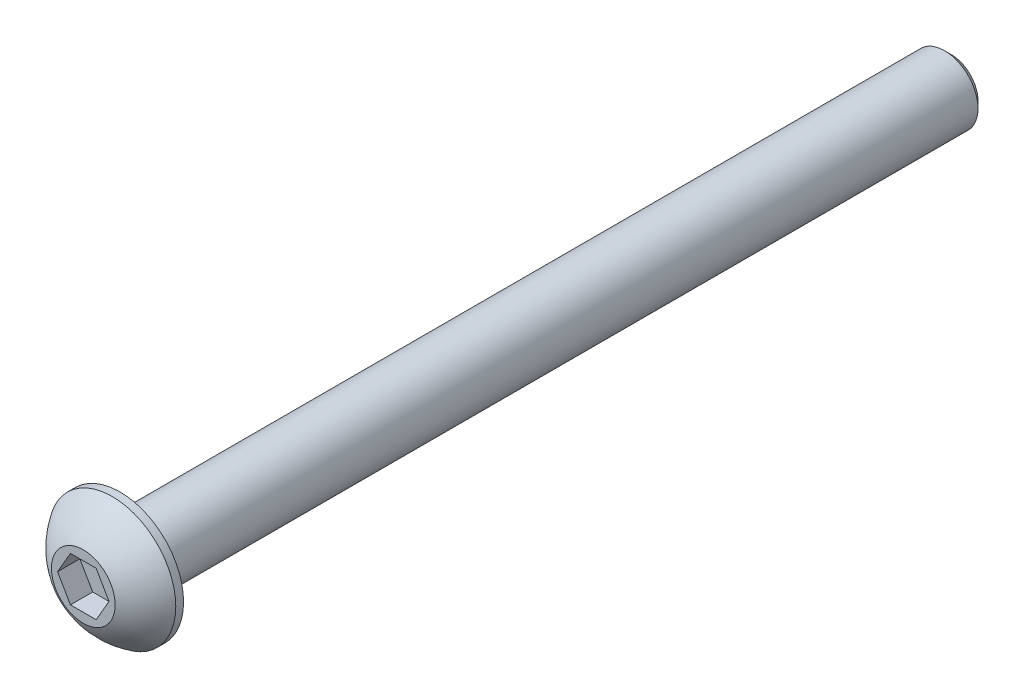
ISO-10303-21;
HEADER;
FILE_DESCRIPTION(('STEP AP214'),'2;1');
FILE_NAME('part.step','',(''),(''),'','','');
FILE_SCHEMA(('AUTOMOTIVE_DESIGN { 1 0 10303 214 1 1 1 1 }'));
ENDSEC;
DATA;
#1=APPLICATION_CONTEXT('core data for automotive mechanical design processes');
#2=APPLICATION_PROTOCOL_DEFINITION('international standard','automotive_design',2000,#1);
#3=PRODUCT_CONTEXT('',#1,'mechanical');
#4=PRODUCT('Part','Part','',(#3));
#5=PRODUCT_RELATED_PRODUCT_CATEGORY('part','',(#4));
#6=PRODUCT_DEFINITION_FORMATION('','',#4);
#7=PRODUCT_DEFINITION_CONTEXT('part definition',#1,'design');
#8=PRODUCT_DEFINITION('design','',#6,#7);
#9=PRODUCT_DEFINITION_SHAPE('','',#8);
#10=(LENGTH_UNIT() NAMED_UNIT(*) SI_UNIT(.MILLI.,.METRE.));
#11=(NAMED_UNIT(*) PLANE_ANGLE_UNIT() SI_UNIT($,.RADIAN.));
#12=(NAMED_UNIT(*) SI_UNIT($,.STERADIAN.) SOLID_ANGLE_UNIT());
#13=UNCERTAINTY_MEASURE_WITH_UNIT(LENGTH_MEASURE(1.E-05),#10,'distance_accuracy_value','');
#14=(GEOMETRIC_REPRESENTATION_CONTEXT(3) GLOBAL_UNCERTAINTY_ASSIGNED_CONTEXT((#13)) GLOBAL_UNIT_ASSIGNED_CONTEXT((#10,
#11,#12)) REPRESENTATION_CONTEXT('',''));
#15=CARTESIAN_POINT('',(0.,0.,0.));
#16=DIRECTION('',(0.,0.,1.));
#17=DIRECTION('',(1.,0.,0.));
#18=AXIS2_PLACEMENT_3D('',#15,#16,#17);
#19=CARTESIAN_POINT('',(0.,0.,-37.3));
#20=DIRECTION('',(0.,0.,1.));
#21=DIRECTION('',(1.,0.,0.));
#22=AXIS2_PLACEMENT_3D('',#19,#20,#21);
#23=PLANE('',#22);
#24=CARTESIAN_POINT('',(0.,0.,-37.3));
#25=DIRECTION('',(0.,0.,1.));
#26=DIRECTION('',(1.,0.,0.));
#27=AXIS2_PLACEMENT_3D('',#24,#25,#26);
#28=CIRCLE('',#27,1.19999999999999);
#29=CARTESIAN_POINT('',(1.19999999999999,0.,-37.3));
#30=VERTEX_POINT('',#29);
#31=EDGE_CURVE('E11',#30,#30,#28,.F.);
#32=ORIENTED_EDGE('',*,*,#31,.T.);
#33=EDGE_LOOP('',(#32));
#34=FACE_BOUND('',#33,.T.);
#35=ADVANCED_FACE('F46',(#34),#23,.F.);
#36=CARTESIAN_POINT('',(0.,0.,1.65));
#37=DIRECTION('',(0.,0.,-1.));
#38=DIRECTION('',(-1.,0.,0.));
#39=AXIS2_PLACEMENT_3D('',#36,#37,#38);
#40=PLANE('',#39);
#41=DIRECTION('',(-0.5,-0.866025403784439,0.));
#42=VECTOR('',#41,1.);
#43=CARTESIAN_POINT('',(-0.577350269189626,1.,1.65));
#44=LINE('',#43,#42);
#45=CARTESIAN_POINT('',(-0.577350269189626,1.,1.65));
#46=VERTEX_POINT('',#45);
#47=CARTESIAN_POINT('',(-1.15470053837925,0.,1.65));
#48=VERTEX_POINT('',#47);
#49=EDGE_CURVE('E136',#46,#48,#44,.T.);
#50=ORIENTED_EDGE('',*,*,#49,.F.);
#51=DIRECTION('',(-1.,0.,0.));
#52=VECTOR('',#51,1.);
#53=CARTESIAN_POINT('',(0.577350269189626,1.,1.65));
#54=LINE('',#53,#52);
#55=CARTESIAN_POINT('',(0.577350269189626,1.,1.65));
#56=VERTEX_POINT('',#55);
#57=EDGE_CURVE('E62',#56,#46,#54,.T.);
#58=ORIENTED_EDGE('',*,*,#57,.F.);
#59=DIRECTION('',(-0.5,0.866025403784438,0.));
#60=VECTOR('',#59,1.);
#61=CARTESIAN_POINT('',(1.15470053837925,0.,1.65));
#62=LINE('',#61,#60);
#63=CARTESIAN_POINT('',(1.15470053837925,0.,1.65));
#64=VERTEX_POINT('',#63);
#65=EDGE_CURVE('E145',#64,#56,#62,.T.);
#66=ORIENTED_EDGE('',*,*,#65,.F.);
#67=DIRECTION('',(0.5,0.866025403784439,0.));
#68=VECTOR('',#67,1.);
#69=CARTESIAN_POINT('',(0.577350269189626,-1.,1.65));
#70=LINE('',#69,#68);
#71=CARTESIAN_POINT('',(0.577350269189626,-1.,1.65));
#72=VERTEX_POINT('',#71);
#73=EDGE_CURVE('E143',#72,#64,#70,.T.);
#74=ORIENTED_EDGE('',*,*,#73,.F.);
#75=DIRECTION('',(1.,0.,0.));
#76=VECTOR('',#75,1.);
#77=CARTESIAN_POINT('',(-0.577350269189625,-1.,1.65));
#78=LINE('',#77,#76);
#79=CARTESIAN_POINT('',(-0.577350269189625,-1.,1.65));
#80=VERTEX_POINT('',#79);
#81=EDGE_CURVE('E110',#80,#72,#78,.T.);
#82=ORIENTED_EDGE('',*,*,#81,.F.);
#83=DIRECTION('',(0.5,-0.866025403784438,0.));
#84=VECTOR('',#83,1.);
#85=CARTESIAN_POINT('',(-1.15470053837925,0.,1.65));
#86=LINE('',#85,#84);
#87=EDGE_CURVE('E139',#48,#80,#86,.T.);
#88=ORIENTED_EDGE('',*,*,#87,.F.);
#89=EDGE_LOOP('',(#50,#58,#66,#74,#82,#88));
#90=FACE_BOUND('',#89,.T.);
#91=CARTESIAN_POINT('',(0.,0.,1.65));
#92=DIRECTION('',(0.,0.,1.));
#93=DIRECTION('',(1.,0.,0.));
#94=AXIS2_PLACEMENT_3D('',#91,#92,#93);
#95=CIRCLE('',#94,1.43);
#96=CARTESIAN_POINT('',(1.43,0.,1.65));
#97=VERTEX_POINT('',#96);
#98=EDGE_CURVE('E163',#97,#97,#95,.T.);
#99=ORIENTED_EDGE('',*,*,#98,.T.);
#100=EDGE_LOOP('',(#99));
#101=FACE_BOUND('',#100,.T.);
#102=ADVANCED_FACE('F180',(#90,#101),#40,.F.);
#103=CARTESIAN_POINT('',(0.,0.,-1.52032985611787));
#104=DIRECTION('',(0.,0.,1.));
#105=DIRECTION('',(1.,0.,0.));
#106=AXIS2_PLACEMENT_3D('',#103,#104,#105);
#107=DEGENERATE_TOROIDAL_SURFACE('',#106,0.167344234474104,3.55,.F.);
#108=ORIENTED_EDGE('',*,*,#98,.F.);
#109=EDGE_LOOP('',(#108));
#110=FACE_BOUND('',#109,.T.);
#111=CARTESIAN_POINT('',(0.,0.,0.35));
#112=DIRECTION('',(0.,0.,1.));
#113=DIRECTION('',(1.,0.,0.));
#114=AXIS2_PLACEMENT_3D('',#111,#112,#113);
#115=CIRCLE('',#114,2.85);
#116=CARTESIAN_POINT('',(2.85,0.,0.35));
#117=VERTEX_POINT('',#116);
#118=EDGE_CURVE('E160',#117,#117,#115,.T.);
#119=ORIENTED_EDGE('',*,*,#118,.T.);
#120=EDGE_LOOP('',(#119));
#121=FACE_BOUND('',#120,.T.);
#122=ADVANCED_FACE('F185',(#110,#121),#107,.F.);
#123=CARTESIAN_POINT('',(0.,0.,0.));
#124=DIRECTION('',(0.,0.,1.));
#125=DIRECTION('',(1.,0.,0.));
#126=AXIS2_PLACEMENT_3D('',#123,#124,#125);
#127=CYLINDRICAL_SURFACE('',#126,2.85);
#128=ORIENTED_EDGE('',*,*,#118,.F.);
#129=EDGE_LOOP('',(#128));
#130=FACE_BOUND('',#129,.T.);
#131=CARTESIAN_POINT('',(0.,0.,0.));
#132=DIRECTION('',(0.,0.,1.));
#133=DIRECTION('',(1.,0.,0.));
#134=AXIS2_PLACEMENT_3D('',#131,#132,#133);
#135=CIRCLE('',#134,2.85);
#136=CARTESIAN_POINT('',(2.85,0.,0.));
#137=VERTEX_POINT('',#136);
#138=EDGE_CURVE('E157',#137,#137,#135,.T.);
#139=ORIENTED_EDGE('',*,*,#138,.T.);
#140=EDGE_LOOP('',(#139));
#141=FACE_BOUND('',#140,.T.);
#142=ADVANCED_FACE('F191',(#130,#141),#127,.T.);
#143=CARTESIAN_POINT('',(0.,1.5,0.));
#144=DIRECTION('',(0.,0.,1.));
#145=DIRECTION('',(1.,0.,0.));
#146=AXIS2_PLACEMENT_3D('',#143,#144,#145);
#147=PLANE('',#146);
#148=ORIENTED_EDGE('',*,*,#138,.F.);
#149=EDGE_LOOP('',(#148));
#150=FACE_BOUND('',#149,.T.);
#151=CARTESIAN_POINT('',(0.,0.,0.));
#152=DIRECTION('',(0.,0.,1.));
#153=DIRECTION('',(1.,0.,0.));
#154=AXIS2_PLACEMENT_3D('',#151,#152,#153);
#155=CIRCLE('',#154,1.5);
#156=CARTESIAN_POINT('',(1.5,0.,0.));
#157=VERTEX_POINT('',#156);
#158=EDGE_CURVE('E149',#157,#157,#155,.T.);
#159=ORIENTED_EDGE('',*,*,#158,.T.);
#160=EDGE_LOOP('',(#159));
#161=FACE_BOUND('',#160,.T.);
#162=ADVANCED_FACE('F195',(#150,#161),#147,.F.);
#163=CARTESIAN_POINT('',(0.,0.,0.));
#164=DIRECTION('',(0.,0.,1.));
#165=DIRECTION('',(1.,0.,0.));
#166=AXIS2_PLACEMENT_3D('',#163,#164,#165);
#167=CYLINDRICAL_SURFACE('',#166,1.5);
#168=CARTESIAN_POINT('',(0.,0.,-37.));
#169=DIRECTION('',(0.,0.,1.));
#170=DIRECTION('',(1.,0.,0.));
#171=AXIS2_PLACEMENT_3D('',#168,#169,#170);
#172=CIRCLE('',#171,1.5);
#173=CARTESIAN_POINT('',(1.5,0.,-37.));
#174=VERTEX_POINT('',#173);
#175=EDGE_CURVE('E55',#174,#174,#172,.T.);
#176=ORIENTED_EDGE('',*,*,#175,.T.);
#177=EDGE_LOOP('',(#176));
#178=FACE_BOUND('',#177,.T.);
#179=ORIENTED_EDGE('',*,*,#158,.F.);
#180=EDGE_LOOP('',(#179));
#181=FACE_BOUND('',#180,.T.);
#182=ADVANCED_FACE('F168',(#178,#181),#167,.T.);
#183=CARTESIAN_POINT('',(0.577350269189626,1.,0.65));
#184=DIRECTION('',(0.,1.,0.));
#185=DIRECTION('',(0.,0.,1.));
#186=AXIS2_PLACEMENT_3D('',#183,#184,#185);
#187=PLANE('',#186);
#188=ORIENTED_EDGE('',*,*,#57,.T.);
#189=DIRECTION('',(0.,0.,1.));
#190=VECTOR('',#189,1.);
#191=CARTESIAN_POINT('',(-0.577350269189626,1.,0.65));
#192=LINE('',#191,#190);
#193=CARTESIAN_POINT('',(-0.577350269189626,1.,0.65));
#194=VERTEX_POINT('',#193);
#195=EDGE_CURVE('E92',#194,#46,#192,.T.);
#196=ORIENTED_EDGE('',*,*,#195,.F.);
#197=DIRECTION('',(-1.,0.,0.));
#198=VECTOR('',#197,1.);
#199=CARTESIAN_POINT('',(0.577350269189626,1.,0.65));
#200=LINE('',#199,#198);
#201=CARTESIAN_POINT('',(0.577350269189626,1.,0.65));
#202=VERTEX_POINT('',#201);
#203=EDGE_CURVE('E147',#202,#194,#200,.T.);
#204=ORIENTED_EDGE('',*,*,#203,.F.);
#205=DIRECTION('',(0.,0.,1.));
#206=VECTOR('',#205,1.);
#207=CARTESIAN_POINT('',(0.577350269189626,1.,0.65));
#208=LINE('',#207,#206);
#209=EDGE_CURVE('E70',#202,#56,#208,.T.);
#210=ORIENTED_EDGE('',*,*,#209,.T.);
#211=EDGE_LOOP('',(#188,#196,#204,#210));
#212=FACE_BOUND('',#211,.T.);
#213=ADVANCED_FACE('F202',(#212),#187,.F.);
#214=CARTESIAN_POINT('',(1.15470053837925,0.,0.65));
#215=DIRECTION('',(0.866025403784439,0.5,0.));
#216=DIRECTION('',(-0.5,0.866025403784438,0.));
#217=AXIS2_PLACEMENT_3D('',#214,#215,#216);
#218=PLANE('',#217);
#219=ORIENTED_EDGE('',*,*,#65,.T.);
#220=ORIENTED_EDGE('',*,*,#209,.F.);
#221=DIRECTION('',(-0.5,0.866025403784438,0.));
#222=VECTOR('',#221,1.);
#223=CARTESIAN_POINT('',(1.15470053837925,0.,0.65));
#224=LINE('',#223,#222);
#225=CARTESIAN_POINT('',(1.15470053837925,0.,0.65));
#226=VERTEX_POINT('',#225);
#227=EDGE_CURVE('E122',#226,#202,#224,.T.);
#228=ORIENTED_EDGE('',*,*,#227,.F.);
#229=DIRECTION('',(0.,0.,1.));
#230=VECTOR('',#229,1.);
#231=CARTESIAN_POINT('',(1.15470053837925,0.,0.65));
#232=LINE('',#231,#230);
#233=EDGE_CURVE('E114',#226,#64,#232,.T.);
#234=ORIENTED_EDGE('',*,*,#233,.T.);
#235=EDGE_LOOP('',(#219,#220,#228,#234));
#236=FACE_BOUND('',#235,.T.);
#237=ADVANCED_FACE('F205',(#236),#218,.F.);
#238=CARTESIAN_POINT('',(0.577350269189626,-1.,0.65));
#239=DIRECTION('',(0.866025403784439,-0.5,0.));
#240=DIRECTION('',(0.5,0.866025403784439,0.));
#241=AXIS2_PLACEMENT_3D('',#238,#239,#240);
#242=PLANE('',#241);
#243=ORIENTED_EDGE('',*,*,#73,.T.);
#244=ORIENTED_EDGE('',*,*,#233,.F.);
#245=DIRECTION('',(0.5,0.866025403784439,0.));
#246=VECTOR('',#245,1.);
#247=CARTESIAN_POINT('',(0.577350269189626,-1.,0.65));
#248=LINE('',#247,#246);
#249=CARTESIAN_POINT('',(0.577350269189626,-1.,0.65));
#250=VERTEX_POINT('',#249);
#251=EDGE_CURVE('E118',#250,#226,#248,.T.);
#252=ORIENTED_EDGE('',*,*,#251,.F.);
#253=DIRECTION('',(0.,0.,1.));
#254=VECTOR('',#253,1.);
#255=CARTESIAN_POINT('',(0.577350269189626,-1.,0.65));
#256=LINE('',#255,#254);
#257=EDGE_CURVE('E103',#250,#72,#256,.T.);
#258=ORIENTED_EDGE('',*,*,#257,.T.);
#259=EDGE_LOOP('',(#243,#244,#252,#258));
#260=FACE_BOUND('',#259,.T.);
#261=ADVANCED_FACE('F119',(#260),#242,.F.);
#262=CARTESIAN_POINT('',(-0.577350269189625,-1.,0.65));
#263=DIRECTION('',(0.,-1.,0.));
#264=DIRECTION('',(1.,0.,0.));
#265=AXIS2_PLACEMENT_3D('',#262,#263,#264);
#266=PLANE('',#265);
#267=ORIENTED_EDGE('',*,*,#81,.T.);
#268=ORIENTED_EDGE('',*,*,#257,.F.);
#269=DIRECTION('',(1.,0.,0.));
#270=VECTOR('',#269,1.);
#271=CARTESIAN_POINT('',(-0.577350269189625,-1.,0.65));
#272=LINE('',#271,#270);
#273=CARTESIAN_POINT('',(-0.577350269189625,-1.,0.65));
#274=VERTEX_POINT('',#273);
#275=EDGE_CURVE('E107',#274,#250,#272,.T.);
#276=ORIENTED_EDGE('',*,*,#275,.F.);
#277=DIRECTION('',(0.,0.,1.));
#278=VECTOR('',#277,1.);
#279=CARTESIAN_POINT('',(-0.577350269189625,-1.,0.65));
#280=LINE('',#279,#278);
#281=EDGE_CURVE('E115',#274,#80,#280,.T.);
#282=ORIENTED_EDGE('',*,*,#281,.T.);
#283=EDGE_LOOP('',(#267,#268,#276,#282));
#284=FACE_BOUND('',#283,.T.);
#285=ADVANCED_FACE('F105',(#284),#266,.F.);
#286=CARTESIAN_POINT('',(-1.15470053837925,0.,0.65));
#287=DIRECTION('',(-0.866025403784438,-0.5,0.));
#288=DIRECTION('',(0.5,-0.866025403784438,0.));
#289=AXIS2_PLACEMENT_3D('',#286,#287,#288);
#290=PLANE('',#289);
#291=ORIENTED_EDGE('',*,*,#87,.T.);
#292=ORIENTED_EDGE('',*,*,#281,.F.);
#293=DIRECTION('',(0.5,-0.866025403784438,0.));
#294=VECTOR('',#293,1.);
#295=CARTESIAN_POINT('',(-1.15470053837925,0.,0.65));
#296=LINE('',#295,#294);
#297=CARTESIAN_POINT('',(-1.15470053837925,0.,0.65));
#298=VERTEX_POINT('',#297);
#299=EDGE_CURVE('E128',#298,#274,#296,.T.);
#300=ORIENTED_EDGE('',*,*,#299,.F.);
#301=DIRECTION('',(0.,0.,1.));
#302=VECTOR('',#301,1.);
#303=CARTESIAN_POINT('',(-1.15470053837925,0.,0.65));
#304=LINE('',#303,#302);
#305=EDGE_CURVE('E152',#298,#48,#304,.T.);
#306=ORIENTED_EDGE('',*,*,#305,.T.);
#307=EDGE_LOOP('',(#291,#292,#300,#306));
#308=FACE_BOUND('',#307,.T.);
#309=ADVANCED_FACE('F208',(#308),#290,.F.);
#310=CARTESIAN_POINT('',(-0.577350269189626,1.,0.65));
#311=DIRECTION('',(-0.866025403784439,0.499999999999999,0.));
#312=DIRECTION('',(-0.5,-0.866025403784439,0.));
#313=AXIS2_PLACEMENT_3D('',#310,#311,#312);
#314=PLANE('',#313);
#315=ORIENTED_EDGE('',*,*,#49,.T.);
#316=ORIENTED_EDGE('',*,*,#305,.F.);
#317=DIRECTION('',(-0.5,-0.866025403784439,0.));
#318=VECTOR('',#317,1.);
#319=CARTESIAN_POINT('',(-0.577350269189626,1.,0.65));
#320=LINE('',#319,#318);
#321=EDGE_CURVE('E130',#194,#298,#320,.T.);
#322=ORIENTED_EDGE('',*,*,#321,.F.);
#323=ORIENTED_EDGE('',*,*,#195,.T.);
#324=EDGE_LOOP('',(#315,#316,#322,#323));
#325=FACE_BOUND('',#324,.T.);
#326=ADVANCED_FACE('F176',(#325),#314,.F.);
#327=CARTESIAN_POINT('',(0.,0.,0.65));
#328=DIRECTION('',(0.,0.,1.));
#329=DIRECTION('',(1.,0.,0.));
#330=AXIS2_PLACEMENT_3D('',#327,#328,#329);
#331=PLANE('',#330);
#332=ORIENTED_EDGE('',*,*,#203,.T.);
#333=ORIENTED_EDGE('',*,*,#321,.T.);
#334=ORIENTED_EDGE('',*,*,#299,.T.);
#335=ORIENTED_EDGE('',*,*,#275,.T.);
#336=ORIENTED_EDGE('',*,*,#251,.T.);
#337=ORIENTED_EDGE('',*,*,#227,.T.);
#338=EDGE_LOOP('',(#332,#333,#334,#335,#336,#337));
#339=FACE_BOUND('',#338,.T.);
#340=ADVANCED_FACE('F125',(#339),#331,.T.);
#341=CARTESIAN_POINT('',(0.,0.,-37.));
#342=DIRECTION('',(0.,0.,1.));
#343=DIRECTION('',(1.,0.,0.));
#344=AXIS2_PLACEMENT_3D('',#341,#342,#343);
#345=CONICAL_SURFACE('',#344,1.5,0.785398163397454);
#346=ORIENTED_EDGE('',*,*,#31,.F.);
#347=EDGE_LOOP('',(#346));
#348=FACE_BOUND('',#347,.T.);
#349=ORIENTED_EDGE('',*,*,#175,.F.);
#350=EDGE_LOOP('',(#349));
#351=FACE_BOUND('',#350,.T.);
#352=ADVANCED_FACE('F49',(#348,#351),#345,.T.);
#353=CLOSED_SHELL('',(#35,#102,#122,#142,#162,#182,#213,#237,#261,#285,#309,#326,#340,#352));
#354=MANIFOLD_SOLID_BREP('B2',#353);
#355=ADVANCED_BREP_SHAPE_REPRESENTATION('',(#18,#354),#14);
#356=SHAPE_DEFINITION_REPRESENTATION(#9,#355);
ENDSEC;
END-ISO-10303-21;
